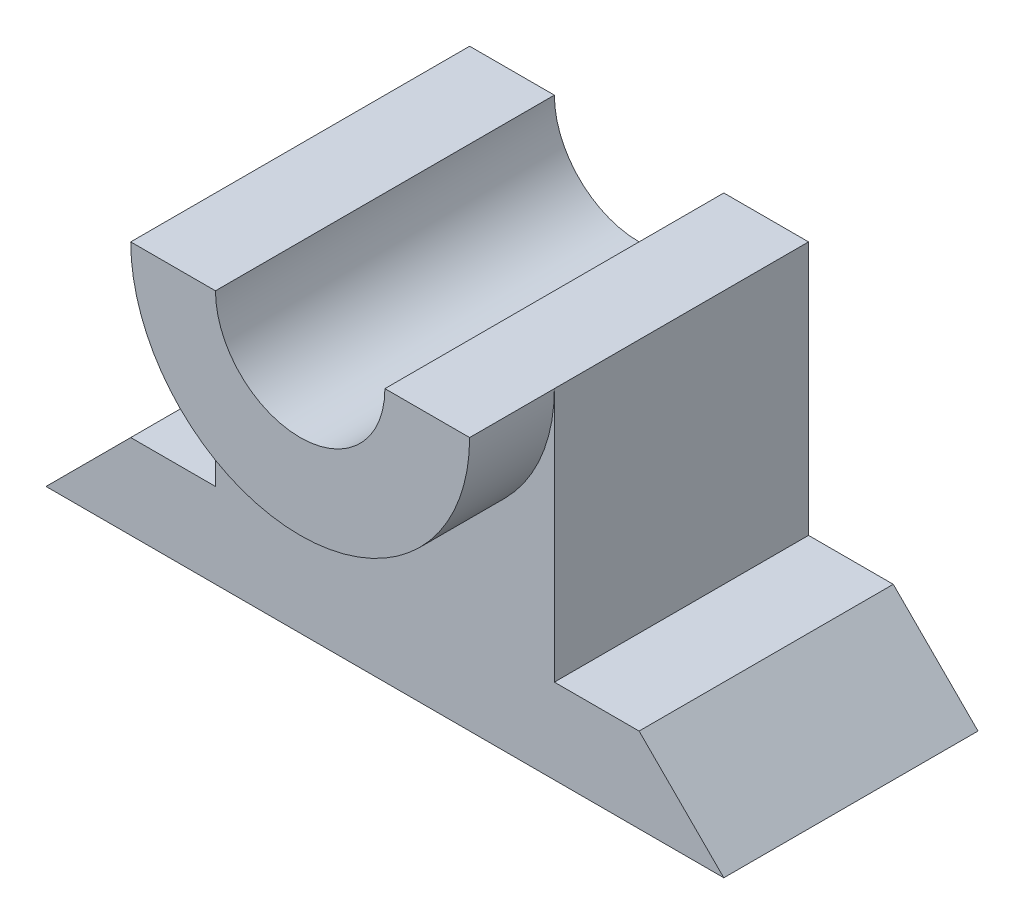
ISO-10303-21;
HEADER;
FILE_DESCRIPTION(('STEP AP214'),'2;1');
FILE_NAME('part.step','',(''),(''),'','','');
FILE_SCHEMA(('AUTOMOTIVE_DESIGN { 1 0 10303 214 1 1 1 1 }'));
ENDSEC;
DATA;
#1=APPLICATION_CONTEXT('core data for automotive mechanical design processes');
#2=APPLICATION_PROTOCOL_DEFINITION('international standard','automotive_design',2000,#1);
#3=PRODUCT_CONTEXT('',#1,'mechanical');
#4=PRODUCT('Part','Part','',(#3));
#5=PRODUCT_RELATED_PRODUCT_CATEGORY('part','',(#4));
#6=PRODUCT_DEFINITION_FORMATION('','',#4);
#7=PRODUCT_DEFINITION_CONTEXT('part definition',#1,'design');
#8=PRODUCT_DEFINITION('design','',#6,#7);
#9=PRODUCT_DEFINITION_SHAPE('','',#8);
#10=(LENGTH_UNIT() NAMED_UNIT(*) SI_UNIT(.MILLI.,.METRE.));
#11=(NAMED_UNIT(*) PLANE_ANGLE_UNIT() SI_UNIT($,.RADIAN.));
#12=(NAMED_UNIT(*) SI_UNIT($,.STERADIAN.) SOLID_ANGLE_UNIT());
#13=UNCERTAINTY_MEASURE_WITH_UNIT(LENGTH_MEASURE(1.E-05),#10,'distance_accuracy_value','');
#14=(GEOMETRIC_REPRESENTATION_CONTEXT(3) GLOBAL_UNCERTAINTY_ASSIGNED_CONTEXT((#13)) GLOBAL_UNIT_ASSIGNED_CONTEXT((#10,
#11,#12)) REPRESENTATION_CONTEXT('',''));
#15=CARTESIAN_POINT('',(0.,0.,0.));
#16=DIRECTION('',(0.,0.,1.));
#17=DIRECTION('',(1.,0.,0.));
#18=AXIS2_PLACEMENT_3D('',#15,#16,#17);
#19=CARTESIAN_POINT('',(5.,0.,7.5));
#20=DIRECTION('',(0.,-1.,0.));
#21=DIRECTION('',(0.,0.,-1.));
#22=AXIS2_PLACEMENT_3D('',#19,#20,#21);
#23=PLANE('',#22);
#24=DIRECTION('',(-1.,0.,0.));
#25=VECTOR('',#24,1.);
#26=CARTESIAN_POINT('',(5.,0.,-7.5));
#27=LINE('',#26,#25);
#28=CARTESIAN_POINT('',(10.,0.,-7.5));
#29=VERTEX_POINT('',#28);
#30=CARTESIAN_POINT('',(5.,0.,-7.5));
#31=VERTEX_POINT('',#30);
#32=EDGE_CURVE('E142',#29,#31,#27,.T.);
#33=ORIENTED_EDGE('',*,*,#32,.T.);
#34=DIRECTION('',(0.,0.,-1.));
#35=VECTOR('',#34,1.);
#36=CARTESIAN_POINT('',(5.,0.,7.5));
#37=LINE('',#36,#35);
#38=CARTESIAN_POINT('',(5.,0.,12.5));
#39=VERTEX_POINT('',#38);
#40=EDGE_CURVE('E11',#39,#31,#37,.T.);
#41=ORIENTED_EDGE('',*,*,#40,.F.);
#42=DIRECTION('',(-1.,0.,0.));
#43=VECTOR('',#42,1.);
#44=CARTESIAN_POINT('',(5.,0.,12.5));
#45=LINE('',#44,#43);
#46=CARTESIAN_POINT('',(10.,0.,12.5));
#47=VERTEX_POINT('',#46);
#48=EDGE_CURVE('E216',#47,#39,#45,.T.);
#49=ORIENTED_EDGE('',*,*,#48,.F.);
#50=DIRECTION('',(0.,0.,-1.));
#51=VECTOR('',#50,1.);
#52=CARTESIAN_POINT('',(10.,0.,12.5));
#53=LINE('',#52,#51);
#54=CARTESIAN_POINT('',(10.,0.,7.5));
#55=VERTEX_POINT('',#54);
#56=EDGE_CURVE('E146',#47,#55,#53,.T.);
#57=ORIENTED_EDGE('',*,*,#56,.T.);
#58=DIRECTION('',(0.,0.,-1.));
#59=VECTOR('',#58,1.);
#60=CARTESIAN_POINT('',(10.,0.,7.5));
#61=LINE('',#60,#59);
#62=EDGE_CURVE('E141',#55,#29,#61,.T.);
#63=ORIENTED_EDGE('',*,*,#62,.T.);
#64=EDGE_LOOP('',(#33,#41,#49,#57,#63));
#65=FACE_BOUND('',#64,.T.);
#66=ADVANCED_FACE('F33',(#65),#23,.F.);
#67=CARTESIAN_POINT('',(0.,0.,7.5));
#68=DIRECTION('',(0.,0.,-1.));
#69=DIRECTION('',(-1.,0.,0.));
#70=AXIS2_PLACEMENT_3D('',#67,#68,#69);
#71=CYLINDRICAL_SURFACE('',#70,5.);
#72=CARTESIAN_POINT('',(0.,0.,-7.5));
#73=DIRECTION('',(0.,0.,-1.));
#74=DIRECTION('',(1.,0.,0.));
#75=AXIS2_PLACEMENT_3D('',#72,#73,#74);
#76=CIRCLE('',#75,5.);
#77=CARTESIAN_POINT('',(-5.,0.,-7.5));
#78=VERTEX_POINT('',#77);
#79=EDGE_CURVE('E145',#31,#78,#76,.T.);
#80=ORIENTED_EDGE('',*,*,#79,.T.);
#81=DIRECTION('',(0.,0.,-1.));
#82=VECTOR('',#81,1.);
#83=CARTESIAN_POINT('',(-5.,0.,7.5));
#84=LINE('',#83,#82);
#85=CARTESIAN_POINT('',(-5.,0.,12.5));
#86=VERTEX_POINT('',#85);
#87=EDGE_CURVE('E41',#86,#78,#84,.T.);
#88=ORIENTED_EDGE('',*,*,#87,.F.);
#89=CARTESIAN_POINT('',(0.,0.,12.5));
#90=DIRECTION('',(0.,0.,-1.));
#91=DIRECTION('',(1.,0.,0.));
#92=AXIS2_PLACEMENT_3D('',#89,#90,#91);
#93=CIRCLE('',#92,5.);
#94=EDGE_CURVE('E214',#39,#86,#93,.T.);
#95=ORIENTED_EDGE('',*,*,#94,.F.);
#96=ORIENTED_EDGE('',*,*,#40,.T.);
#97=EDGE_LOOP('',(#80,#88,#95,#96));
#98=FACE_BOUND('',#97,.T.);
#99=ADVANCED_FACE('F235',(#98),#71,.F.);
#100=CARTESIAN_POINT('',(-10.,0.,7.5));
#101=DIRECTION('',(0.,-1.,0.));
#102=DIRECTION('',(0.,0.,-1.));
#103=AXIS2_PLACEMENT_3D('',#100,#101,#102);
#104=PLANE('',#103);
#105=DIRECTION('',(-1.,0.,0.));
#106=VECTOR('',#105,1.);
#107=CARTESIAN_POINT('',(-10.,0.,-7.5));
#108=LINE('',#107,#106);
#109=CARTESIAN_POINT('',(-10.,0.,-7.5));
#110=VERTEX_POINT('',#109);
#111=EDGE_CURVE('E148',#78,#110,#108,.T.);
#112=ORIENTED_EDGE('',*,*,#111,.T.);
#113=DIRECTION('',(0.,0.,-1.));
#114=VECTOR('',#113,1.);
#115=CARTESIAN_POINT('',(-10.,0.,7.5));
#116=LINE('',#115,#114);
#117=CARTESIAN_POINT('',(-10.,0.,7.5));
#118=VERTEX_POINT('',#117);
#119=EDGE_CURVE('E173',#118,#110,#116,.T.);
#120=ORIENTED_EDGE('',*,*,#119,.F.);
#121=DIRECTION('',(0.,0.,-1.));
#122=VECTOR('',#121,1.);
#123=CARTESIAN_POINT('',(-10.,0.,12.5));
#124=LINE('',#123,#122);
#125=CARTESIAN_POINT('',(-10.,0.,12.5));
#126=VERTEX_POINT('',#125);
#127=EDGE_CURVE('E208',#126,#118,#124,.T.);
#128=ORIENTED_EDGE('',*,*,#127,.F.);
#129=DIRECTION('',(-1.,0.,0.));
#130=VECTOR('',#129,1.);
#131=CARTESIAN_POINT('',(-10.,0.,12.5));
#132=LINE('',#131,#130);
#133=EDGE_CURVE('E184',#86,#126,#132,.T.);
#134=ORIENTED_EDGE('',*,*,#133,.F.);
#135=ORIENTED_EDGE('',*,*,#87,.T.);
#136=EDGE_LOOP('',(#112,#120,#128,#134,#135));
#137=FACE_BOUND('',#136,.T.);
#138=ADVANCED_FACE('F180',(#137),#104,.F.);
#139=CARTESIAN_POINT('',(-10.,0.,7.5));
#140=DIRECTION('',(1.,0.,0.));
#141=DIRECTION('',(0.,1.,0.));
#142=AXIS2_PLACEMENT_3D('',#139,#140,#141);
#143=PLANE('',#142);
#144=DIRECTION('',(0.,-1.,0.));
#145=VECTOR('',#144,1.);
#146=CARTESIAN_POINT('',(-10.,0.,-7.5));
#147=LINE('',#146,#145);
#148=CARTESIAN_POINT('',(-10.,-15.,-7.5));
#149=VERTEX_POINT('',#148);
#150=EDGE_CURVE('E150',#110,#149,#147,.T.);
#151=ORIENTED_EDGE('',*,*,#150,.T.);
#152=DIRECTION('',(0.,0.,-1.));
#153=VECTOR('',#152,1.);
#154=CARTESIAN_POINT('',(-10.,-15.,7.5));
#155=LINE('',#154,#153);
#156=CARTESIAN_POINT('',(-10.,-15.,7.5));
#157=VERTEX_POINT('',#156);
#158=EDGE_CURVE('E170',#157,#149,#155,.T.);
#159=ORIENTED_EDGE('',*,*,#158,.F.);
#160=DIRECTION('',(0.,-1.,0.));
#161=VECTOR('',#160,1.);
#162=CARTESIAN_POINT('',(-10.,0.,7.5));
#163=LINE('',#162,#161);
#164=EDGE_CURVE('E161',#118,#157,#163,.T.);
#165=ORIENTED_EDGE('',*,*,#164,.F.);
#166=ORIENTED_EDGE('',*,*,#119,.T.);
#167=EDGE_LOOP('',(#151,#159,#165,#166));
#168=FACE_BOUND('',#167,.T.);
#169=ADVANCED_FACE('F196',(#168),#143,.F.);
#170=CARTESIAN_POINT('',(-10.,-15.,7.5));
#171=DIRECTION('',(0.,-1.,0.));
#172=DIRECTION('',(0.,0.,-1.));
#173=AXIS2_PLACEMENT_3D('',#170,#171,#172);
#174=PLANE('',#173);
#175=DIRECTION('',(-1.,0.,0.));
#176=VECTOR('',#175,1.);
#177=CARTESIAN_POINT('',(-10.,-15.,-7.5));
#178=LINE('',#177,#176);
#179=CARTESIAN_POINT('',(-15.,-15.,-7.5));
#180=VERTEX_POINT('',#179);
#181=EDGE_CURVE('E152',#149,#180,#178,.T.);
#182=ORIENTED_EDGE('',*,*,#181,.T.);
#183=DIRECTION('',(0.,0.,-1.));
#184=VECTOR('',#183,1.);
#185=CARTESIAN_POINT('',(-15.,-15.,7.5));
#186=LINE('',#185,#184);
#187=CARTESIAN_POINT('',(-15.,-15.,7.5));
#188=VERTEX_POINT('',#187);
#189=EDGE_CURVE('E167',#188,#180,#186,.T.);
#190=ORIENTED_EDGE('',*,*,#189,.F.);
#191=DIRECTION('',(-1.,0.,0.));
#192=VECTOR('',#191,1.);
#193=CARTESIAN_POINT('',(-10.,-15.,7.5));
#194=LINE('',#193,#192);
#195=EDGE_CURVE('E202',#157,#188,#194,.T.);
#196=ORIENTED_EDGE('',*,*,#195,.F.);
#197=ORIENTED_EDGE('',*,*,#158,.T.);
#198=EDGE_LOOP('',(#182,#190,#196,#197));
#199=FACE_BOUND('',#198,.T.);
#200=ADVANCED_FACE('F200',(#199),#174,.F.);
#201=CARTESIAN_POINT('',(-15.,-15.,7.5));
#202=DIRECTION('',(0.707106781186547,-0.707106781186547,0.));
#203=DIRECTION('',(0.707106781186548,0.707106781186548,0.));
#204=AXIS2_PLACEMENT_3D('',#201,#202,#203);
#205=PLANE('',#204);
#206=DIRECTION('',(-0.707106781186547,-0.707106781186547,0.));
#207=VECTOR('',#206,1.);
#208=CARTESIAN_POINT('',(-15.,-15.,-7.5));
#209=LINE('',#208,#207);
#210=CARTESIAN_POINT('',(-20.,-20.,-7.5));
#211=VERTEX_POINT('',#210);
#212=EDGE_CURVE('E154',#180,#211,#209,.T.);
#213=ORIENTED_EDGE('',*,*,#212,.T.);
#214=DIRECTION('',(0.,0.,-1.));
#215=VECTOR('',#214,1.);
#216=CARTESIAN_POINT('',(-20.,-20.,7.5));
#217=LINE('',#216,#215);
#218=CARTESIAN_POINT('',(-20.,-20.,7.5));
#219=VERTEX_POINT('',#218);
#220=EDGE_CURVE('E131',#219,#211,#217,.T.);
#221=ORIENTED_EDGE('',*,*,#220,.F.);
#222=DIRECTION('',(-0.707106781186547,-0.707106781186547,0.));
#223=VECTOR('',#222,1.);
#224=CARTESIAN_POINT('',(-15.,-15.,7.5));
#225=LINE('',#224,#223);
#226=EDGE_CURVE('E119',#188,#219,#225,.T.);
#227=ORIENTED_EDGE('',*,*,#226,.F.);
#228=ORIENTED_EDGE('',*,*,#189,.T.);
#229=EDGE_LOOP('',(#213,#221,#227,#228));
#230=FACE_BOUND('',#229,.T.);
#231=ADVANCED_FACE('F248',(#230),#205,.F.);
#232=CARTESIAN_POINT('',(20.,-20.,7.5));
#233=DIRECTION('',(0.,1.,0.));
#234=DIRECTION('',(0.,0.,1.));
#235=AXIS2_PLACEMENT_3D('',#232,#233,#234);
#236=PLANE('',#235);
#237=DIRECTION('',(1.,0.,0.));
#238=VECTOR('',#237,1.);
#239=CARTESIAN_POINT('',(20.,-20.,-7.5));
#240=LINE('',#239,#238);
#241=CARTESIAN_POINT('',(20.,-20.,-7.5));
#242=VERTEX_POINT('',#241);
#243=EDGE_CURVE('E128',#211,#242,#240,.T.);
#244=ORIENTED_EDGE('',*,*,#243,.T.);
#245=DIRECTION('',(0.,0.,-1.));
#246=VECTOR('',#245,1.);
#247=CARTESIAN_POINT('',(20.,-20.,7.5));
#248=LINE('',#247,#246);
#249=CARTESIAN_POINT('',(20.,-20.,7.5));
#250=VERTEX_POINT('',#249);
#251=EDGE_CURVE('E125',#250,#242,#248,.T.);
#252=ORIENTED_EDGE('',*,*,#251,.F.);
#253=DIRECTION('',(1.,0.,0.));
#254=VECTOR('',#253,1.);
#255=CARTESIAN_POINT('',(20.,-20.,7.5));
#256=LINE('',#255,#254);
#257=EDGE_CURVE('E112',#219,#250,#256,.T.);
#258=ORIENTED_EDGE('',*,*,#257,.F.);
#259=ORIENTED_EDGE('',*,*,#220,.T.);
#260=EDGE_LOOP('',(#244,#252,#258,#259));
#261=FACE_BOUND('',#260,.T.);
#262=ADVANCED_FACE('F126',(#261),#236,.F.);
#263=CARTESIAN_POINT('',(15.,-15.,7.5));
#264=DIRECTION('',(-0.707106781186547,-0.707106781186547,0.));
#265=DIRECTION('',(0.707106781186548,-0.707106781186548,0.));
#266=AXIS2_PLACEMENT_3D('',#263,#264,#265);
#267=PLANE('',#266);
#268=DIRECTION('',(-0.707106781186547,0.707106781186547,0.));
#269=VECTOR('',#268,1.);
#270=CARTESIAN_POINT('',(15.,-15.,-7.5));
#271=LINE('',#270,#269);
#272=CARTESIAN_POINT('',(15.,-15.,-7.5));
#273=VERTEX_POINT('',#272);
#274=EDGE_CURVE('E157',#242,#273,#271,.T.);
#275=ORIENTED_EDGE('',*,*,#274,.T.);
#276=DIRECTION('',(0.,0.,-1.));
#277=VECTOR('',#276,1.);
#278=CARTESIAN_POINT('',(15.,-15.,7.5));
#279=LINE('',#278,#277);
#280=CARTESIAN_POINT('',(15.,-15.,7.5));
#281=VERTEX_POINT('',#280);
#282=EDGE_CURVE('E132',#281,#273,#279,.T.);
#283=ORIENTED_EDGE('',*,*,#282,.F.);
#284=DIRECTION('',(-0.707106781186547,0.707106781186547,0.));
#285=VECTOR('',#284,1.);
#286=CARTESIAN_POINT('',(15.,-15.,7.5));
#287=LINE('',#286,#285);
#288=EDGE_CURVE('E116',#250,#281,#287,.T.);
#289=ORIENTED_EDGE('',*,*,#288,.F.);
#290=ORIENTED_EDGE('',*,*,#251,.T.);
#291=EDGE_LOOP('',(#275,#283,#289,#290));
#292=FACE_BOUND('',#291,.T.);
#293=ADVANCED_FACE('F134',(#292),#267,.F.);
#294=CARTESIAN_POINT('',(10.,-15.,7.5));
#295=DIRECTION('',(0.,-1.,0.));
#296=DIRECTION('',(0.,0.,-1.));
#297=AXIS2_PLACEMENT_3D('',#294,#295,#296);
#298=PLANE('',#297);
#299=DIRECTION('',(-1.,0.,0.));
#300=VECTOR('',#299,1.);
#301=CARTESIAN_POINT('',(10.,-15.,-7.5));
#302=LINE('',#301,#300);
#303=CARTESIAN_POINT('',(10.,-15.,-7.5));
#304=VERTEX_POINT('',#303);
#305=EDGE_CURVE('E84',#273,#304,#302,.T.);
#306=ORIENTED_EDGE('',*,*,#305,.T.);
#307=DIRECTION('',(0.,0.,-1.));
#308=VECTOR('',#307,1.);
#309=CARTESIAN_POINT('',(10.,-15.,7.5));
#310=LINE('',#309,#308);
#311=CARTESIAN_POINT('',(10.,-15.,7.5));
#312=VERTEX_POINT('',#311);
#313=EDGE_CURVE('E163',#312,#304,#310,.T.);
#314=ORIENTED_EDGE('',*,*,#313,.F.);
#315=DIRECTION('',(-1.,0.,0.));
#316=VECTOR('',#315,1.);
#317=CARTESIAN_POINT('',(10.,-15.,7.5));
#318=LINE('',#317,#316);
#319=EDGE_CURVE('E49',#281,#312,#318,.T.);
#320=ORIENTED_EDGE('',*,*,#319,.F.);
#321=ORIENTED_EDGE('',*,*,#282,.T.);
#322=EDGE_LOOP('',(#306,#314,#320,#321));
#323=FACE_BOUND('',#322,.T.);
#324=ADVANCED_FACE('F256',(#323),#298,.F.);
#325=CARTESIAN_POINT('',(10.,0.,7.5));
#326=DIRECTION('',(-1.,0.,0.));
#327=DIRECTION('',(0.,-1.,0.));
#328=AXIS2_PLACEMENT_3D('',#325,#326,#327);
#329=PLANE('',#328);
#330=DIRECTION('',(0.,1.,0.));
#331=VECTOR('',#330,1.);
#332=CARTESIAN_POINT('',(10.,0.,-7.5));
#333=LINE('',#332,#331);
#334=EDGE_CURVE('E91',#304,#29,#333,.T.);
#335=ORIENTED_EDGE('',*,*,#334,.T.);
#336=ORIENTED_EDGE('',*,*,#62,.F.);
#337=DIRECTION('',(0.,1.,0.));
#338=VECTOR('',#337,1.);
#339=CARTESIAN_POINT('',(10.,0.,7.5));
#340=LINE('',#339,#338);
#341=EDGE_CURVE('E136',#312,#55,#340,.T.);
#342=ORIENTED_EDGE('',*,*,#341,.F.);
#343=ORIENTED_EDGE('',*,*,#313,.T.);
#344=EDGE_LOOP('',(#335,#336,#342,#343));
#345=FACE_BOUND('',#344,.T.);
#346=ADVANCED_FACE('F233',(#345),#329,.F.);
#347=CARTESIAN_POINT('',(0.,0.,7.5));
#348=DIRECTION('',(0.,0.,1.));
#349=DIRECTION('',(1.,0.,0.));
#350=AXIS2_PLACEMENT_3D('',#347,#348,#349);
#351=PLANE('',#350);
#352=CARTESIAN_POINT('',(0.,0.,7.5));
#353=DIRECTION('',(0.,0.,1.));
#354=DIRECTION('',(1.,0.,0.));
#355=AXIS2_PLACEMENT_3D('',#352,#353,#354);
#356=CIRCLE('',#355,10.);
#357=EDGE_CURVE('E98',#118,#55,#356,.T.);
#358=ORIENTED_EDGE('',*,*,#357,.F.);
#359=ORIENTED_EDGE('',*,*,#164,.T.);
#360=ORIENTED_EDGE('',*,*,#195,.T.);
#361=ORIENTED_EDGE('',*,*,#226,.T.);
#362=ORIENTED_EDGE('',*,*,#257,.T.);
#363=ORIENTED_EDGE('',*,*,#288,.T.);
#364=ORIENTED_EDGE('',*,*,#319,.T.);
#365=ORIENTED_EDGE('',*,*,#341,.T.);
#366=EDGE_LOOP('',(#358,#359,#360,#361,#362,#363,#364,#365));
#367=FACE_BOUND('',#366,.T.);
#368=ADVANCED_FACE('F114',(#367),#351,.T.);
#369=CARTESIAN_POINT('',(0.,0.,-7.5));
#370=DIRECTION('',(0.,0.,1.));
#371=DIRECTION('',(1.,0.,0.));
#372=AXIS2_PLACEMENT_3D('',#369,#370,#371);
#373=PLANE('',#372);
#374=ORIENTED_EDGE('',*,*,#32,.F.);
#375=ORIENTED_EDGE('',*,*,#334,.F.);
#376=ORIENTED_EDGE('',*,*,#305,.F.);
#377=ORIENTED_EDGE('',*,*,#274,.F.);
#378=ORIENTED_EDGE('',*,*,#243,.F.);
#379=ORIENTED_EDGE('',*,*,#212,.F.);
#380=ORIENTED_EDGE('',*,*,#181,.F.);
#381=ORIENTED_EDGE('',*,*,#150,.F.);
#382=ORIENTED_EDGE('',*,*,#111,.F.);
#383=ORIENTED_EDGE('',*,*,#79,.F.);
#384=EDGE_LOOP('',(#374,#375,#376,#377,#378,#379,#380,#381,#382,#383));
#385=FACE_BOUND('',#384,.T.);
#386=ADVANCED_FACE('F191',(#385),#373,.F.);
#387=CARTESIAN_POINT('',(0.,0.,12.5));
#388=DIRECTION('',(0.,0.,-1.));
#389=DIRECTION('',(-1.,0.,0.));
#390=AXIS2_PLACEMENT_3D('',#387,#388,#389);
#391=CYLINDRICAL_SURFACE('',#390,10.);
#392=ORIENTED_EDGE('',*,*,#357,.T.);
#393=ORIENTED_EDGE('',*,*,#56,.F.);
#394=CARTESIAN_POINT('',(0.,0.,12.5));
#395=DIRECTION('',(0.,0.,1.));
#396=DIRECTION('',(1.,0.,0.));
#397=AXIS2_PLACEMENT_3D('',#394,#395,#396);
#398=CIRCLE('',#397,10.);
#399=EDGE_CURVE('E212',#126,#47,#398,.T.);
#400=ORIENTED_EDGE('',*,*,#399,.F.);
#401=ORIENTED_EDGE('',*,*,#127,.T.);
#402=EDGE_LOOP('',(#392,#393,#400,#401));
#403=FACE_BOUND('',#402,.T.);
#404=ADVANCED_FACE('F229',(#403),#391,.T.);
#405=CARTESIAN_POINT('',(0.,0.,12.5));
#406=DIRECTION('',(0.,0.,1.));
#407=DIRECTION('',(1.,0.,0.));
#408=AXIS2_PLACEMENT_3D('',#405,#406,#407);
#409=PLANE('',#408);
#410=ORIENTED_EDGE('',*,*,#399,.T.);
#411=ORIENTED_EDGE('',*,*,#48,.T.);
#412=ORIENTED_EDGE('',*,*,#94,.T.);
#413=ORIENTED_EDGE('',*,*,#133,.T.);
#414=EDGE_LOOP('',(#410,#411,#412,#413));
#415=FACE_BOUND('',#414,.T.);
#416=ADVANCED_FACE('F224',(#415),#409,.T.);
#417=CLOSED_SHELL('',(#66,#99,#138,#169,#200,#231,#262,#293,#324,#346,#368,#386,#404,#416));
#418=MANIFOLD_SOLID_BREP('B2',#417);
#419=ADVANCED_BREP_SHAPE_REPRESENTATION('',(#18,#418),#14);
#420=SHAPE_DEFINITION_REPRESENTATION(#9,#419);
ENDSEC;
END-ISO-10303-21;
